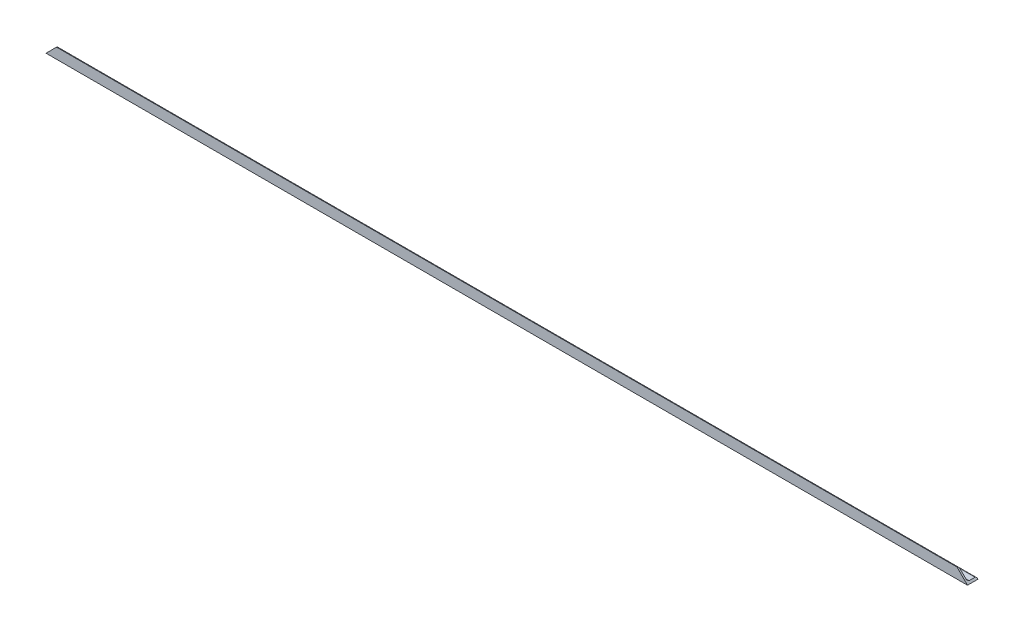
ISO-10303-21;
HEADER;
FILE_DESCRIPTION(('STEP AP214'),'2;1');
FILE_NAME('part.step','',(''),(''),'','','');
FILE_SCHEMA(('AUTOMOTIVE_DESIGN { 1 0 10303 214 1 1 1 1 }'));
ENDSEC;
DATA;
#1=APPLICATION_CONTEXT('core data for automotive mechanical design processes');
#2=APPLICATION_PROTOCOL_DEFINITION('international standard','automotive_design',2000,#1);
#3=PRODUCT_CONTEXT('',#1,'mechanical');
#4=PRODUCT('Part','Part','',(#3));
#5=PRODUCT_RELATED_PRODUCT_CATEGORY('part','',(#4));
#6=PRODUCT_DEFINITION_FORMATION('','',#4);
#7=PRODUCT_DEFINITION_CONTEXT('part definition',#1,'design');
#8=PRODUCT_DEFINITION('design','',#6,#7);
#9=PRODUCT_DEFINITION_SHAPE('','',#8);
#10=(LENGTH_UNIT() NAMED_UNIT(*) SI_UNIT(.MILLI.,.METRE.));
#11=(NAMED_UNIT(*) PLANE_ANGLE_UNIT() SI_UNIT($,.RADIAN.));
#12=(NAMED_UNIT(*) SI_UNIT($,.STERADIAN.) SOLID_ANGLE_UNIT());
#13=UNCERTAINTY_MEASURE_WITH_UNIT(LENGTH_MEASURE(1.E-05),#10,'distance_accuracy_value','');
#14=(GEOMETRIC_REPRESENTATION_CONTEXT(3) GLOBAL_UNCERTAINTY_ASSIGNED_CONTEXT((#13)) GLOBAL_UNIT_ASSIGNED_CONTEXT((#10,
#11,#12)) REPRESENTATION_CONTEXT('',''));
#15=CARTESIAN_POINT('',(0.,0.,0.));
#16=DIRECTION('',(0.,0.,1.));
#17=DIRECTION('',(1.,0.,0.));
#18=AXIS2_PLACEMENT_3D('',#15,#16,#17);
#19=CARTESIAN_POINT('',(1754.,0.,-20.));
#20=DIRECTION('',(0.,1.,0.));
#21=DIRECTION('',(0.,0.,1.));
#22=AXIS2_PLACEMENT_3D('',#19,#20,#21);
#23=PLANE('',#22);
#24=DIRECTION('',(0.,0.,-1.));
#25=VECTOR('',#24,1.);
#26=CARTESIAN_POINT('',(0.,0.,-20.));
#27=LINE('',#26,#25);
#28=CARTESIAN_POINT('',(0.,0.,0.));
#29=VERTEX_POINT('',#28);
#30=CARTESIAN_POINT('',(0.,0.,-20.));
#31=VERTEX_POINT('',#30);
#32=EDGE_CURVE('E119',#29,#31,#27,.T.);
#33=ORIENTED_EDGE('',*,*,#32,.T.);
#34=DIRECTION('',(-1.,0.,0.));
#35=VECTOR('',#34,1.);
#36=CARTESIAN_POINT('',(1754.,0.,-20.));
#37=LINE('',#36,#35);
#38=CARTESIAN_POINT('',(1754.,0.,-20.));
#39=VERTEX_POINT('',#38);
#40=EDGE_CURVE('E13',#39,#31,#37,.T.);
#41=ORIENTED_EDGE('',*,*,#40,.F.);
#42=DIRECTION('',(0.,0.,-1.));
#43=VECTOR('',#42,1.);
#44=CARTESIAN_POINT('',(1754.,0.,-20.));
#45=LINE('',#44,#43);
#46=CARTESIAN_POINT('',(1754.,0.,0.));
#47=VERTEX_POINT('',#46);
#48=EDGE_CURVE('E130',#47,#39,#45,.T.);
#49=ORIENTED_EDGE('',*,*,#48,.F.);
#50=DIRECTION('',(-1.,0.,0.));
#51=VECTOR('',#50,1.);
#52=CARTESIAN_POINT('',(1754.,0.,0.));
#53=LINE('',#52,#51);
#54=EDGE_CURVE('E136',#47,#29,#53,.T.);
#55=ORIENTED_EDGE('',*,*,#54,.T.);
#56=EDGE_LOOP('',(#33,#41,#49,#55));
#57=FACE_BOUND('',#56,.T.);
#58=ADVANCED_FACE('F65',(#57),#23,.F.);
#59=CARTESIAN_POINT('',(1754.,0.,-17.));
#60=DIRECTION('',(-1.,0.,0.));
#61=DIRECTION('',(0.,0.,1.));
#62=AXIS2_PLACEMENT_3D('',#59,#60,#61);
#63=CYLINDRICAL_SURFACE('',#62,3.);
#64=ORIENTED_EDGE('',*,*,#40,.T.);
#65=CARTESIAN_POINT('',(0.,0.,-17.));
#66=DIRECTION('',(0.707106781186548,-0.707106781186548,0.));
#67=DIRECTION('',(-0.707106781186548,-0.707106781186548,0.));
#68=AXIS2_PLACEMENT_3D('',#65,#66,#67);
#69=ELLIPSE('',#68,4.24264068711928,3.);
#70=CARTESIAN_POINT('',(3.00000000000011,3.,-17.));
#71=VERTEX_POINT('',#70);
#72=EDGE_CURVE('E125',#31,#71,#69,.T.);
#73=ORIENTED_EDGE('',*,*,#72,.T.);
#74=DIRECTION('',(-1.,0.,0.));
#75=VECTOR('',#74,1.);
#76=CARTESIAN_POINT('',(1754.,3.,-17.));
#77=LINE('',#76,#75);
#78=CARTESIAN_POINT('',(1751.,3.,-17.));
#79=VERTEX_POINT('',#78);
#80=EDGE_CURVE('E74',#79,#71,#77,.T.);
#81=ORIENTED_EDGE('',*,*,#80,.F.);
#82=CARTESIAN_POINT('',(1754.,0.,-17.));
#83=DIRECTION('',(-0.707106781186553,-0.707106781186542,0.));
#84=DIRECTION('',(-0.707106781186542,0.707106781186553,0.));
#85=AXIS2_PLACEMENT_3D('',#82,#83,#84);
#86=ELLIPSE('',#85,4.24264068711925,3.);
#87=EDGE_CURVE('E131',#79,#39,#86,.T.);
#88=ORIENTED_EDGE('',*,*,#87,.T.);
#89=EDGE_LOOP('',(#64,#73,#81,#88));
#90=FACE_BOUND('',#89,.T.);
#91=ADVANCED_FACE('F173',(#90),#63,.T.);
#92=CARTESIAN_POINT('',(1754.,3.,-6.5));
#93=DIRECTION('',(0.,-1.,0.));
#94=DIRECTION('',(0.,0.,-1.));
#95=AXIS2_PLACEMENT_3D('',#92,#93,#94);
#96=PLANE('',#95);
#97=ORIENTED_EDGE('',*,*,#80,.T.);
#98=DIRECTION('',(0.,0.,1.));
#99=VECTOR('',#98,1.);
#100=CARTESIAN_POINT('',(3.00000000000011,3.,-6.5));
#101=LINE('',#100,#99);
#102=CARTESIAN_POINT('',(3.00000000000011,3.,-6.5));
#103=VERTEX_POINT('',#102);
#104=EDGE_CURVE('E169',#71,#103,#101,.T.);
#105=ORIENTED_EDGE('',*,*,#104,.T.);
#106=DIRECTION('',(-1.,0.,0.));
#107=VECTOR('',#106,1.);
#108=CARTESIAN_POINT('',(1754.,3.,-6.5));
#109=LINE('',#108,#107);
#110=CARTESIAN_POINT('',(1751.,3.,-6.5));
#111=VERTEX_POINT('',#110);
#112=EDGE_CURVE('E158',#111,#103,#109,.T.);
#113=ORIENTED_EDGE('',*,*,#112,.F.);
#114=DIRECTION('',(0.,0.,-1.));
#115=VECTOR('',#114,1.);
#116=CARTESIAN_POINT('',(1751.,3.,-6.5));
#117=LINE('',#116,#115);
#118=EDGE_CURVE('E170',#111,#79,#117,.T.);
#119=ORIENTED_EDGE('',*,*,#118,.T.);
#120=EDGE_LOOP('',(#97,#105,#113,#119));
#121=FACE_BOUND('',#120,.T.);
#122=ADVANCED_FACE('F167',(#121),#96,.F.);
#123=CARTESIAN_POINT('',(1754.,6.5,-6.5));
#124=DIRECTION('',(-1.,0.,0.));
#125=DIRECTION('',(0.,0.,1.));
#126=AXIS2_PLACEMENT_3D('',#123,#124,#125);
#127=CYLINDRICAL_SURFACE('',#126,3.5);
#128=ORIENTED_EDGE('',*,*,#112,.T.);
#129=CARTESIAN_POINT('',(6.49999999999995,6.5,-6.5));
#130=DIRECTION('',(0.707106781186548,-0.707106781186548,0.));
#131=DIRECTION('',(-0.707106781186548,-0.707106781186548,0.));
#132=AXIS2_PLACEMENT_3D('',#129,#130,#131);
#133=ELLIPSE('',#132,4.94974746830583,3.5);
#134=CARTESIAN_POINT('',(6.50000000000017,6.50000000000006,-3.));
#135=VERTEX_POINT('',#134);
#136=EDGE_CURVE('E182',#103,#135,#133,.F.);
#137=ORIENTED_EDGE('',*,*,#136,.T.);
#138=DIRECTION('',(-1.,0.,0.));
#139=VECTOR('',#138,1.);
#140=CARTESIAN_POINT('',(1754.,6.5,-3.));
#141=LINE('',#140,#139);
#142=CARTESIAN_POINT('',(1747.5,6.5,-3.));
#143=VERTEX_POINT('',#142);
#144=EDGE_CURVE('E154',#143,#135,#141,.T.);
#145=ORIENTED_EDGE('',*,*,#144,.F.);
#146=CARTESIAN_POINT('',(1747.5,6.5,-6.5));
#147=DIRECTION('',(-0.707106781186553,-0.707106781186542,0.));
#148=DIRECTION('',(-0.707106781186542,0.707106781186553,0.));
#149=AXIS2_PLACEMENT_3D('',#146,#147,#148);
#150=ELLIPSE('',#149,4.9497474683058,3.5);
#151=EDGE_CURVE('E189',#143,#111,#150,.F.);
#152=ORIENTED_EDGE('',*,*,#151,.T.);
#153=EDGE_LOOP('',(#128,#137,#145,#152));
#154=FACE_BOUND('',#153,.T.);
#155=ADVANCED_FACE('F198',(#154),#127,.F.);
#156=CARTESIAN_POINT('',(1754.,17.,-3.));
#157=DIRECTION('',(0.,0.,1.));
#158=DIRECTION('',(0.,-1.,0.));
#159=AXIS2_PLACEMENT_3D('',#156,#157,#158);
#160=PLANE('',#159);
#161=ORIENTED_EDGE('',*,*,#144,.T.);
#162=DIRECTION('',(0.707106781186548,0.707106781186548,0.));
#163=VECTOR('',#162,1.);
#164=CARTESIAN_POINT('',(885.5,885.5,-3.00000000000004));
#165=LINE('',#164,#163);
#166=CARTESIAN_POINT('',(16.9999999999999,17.,-3.));
#167=VERTEX_POINT('',#166);
#168=EDGE_CURVE('E205',#135,#167,#165,.T.);
#169=ORIENTED_EDGE('',*,*,#168,.T.);
#170=DIRECTION('',(-1.,0.,0.));
#171=VECTOR('',#170,1.);
#172=CARTESIAN_POINT('',(1754.,17.,-3.));
#173=LINE('',#172,#171);
#174=CARTESIAN_POINT('',(1737.,17.,-3.));
#175=VERTEX_POINT('',#174);
#176=EDGE_CURVE('E147',#175,#167,#173,.T.);
#177=ORIENTED_EDGE('',*,*,#176,.F.);
#178=DIRECTION('',(0.707106781186542,-0.707106781186553,0.));
#179=VECTOR('',#178,1.);
#180=CARTESIAN_POINT('',(1745.5,8.50000000000013,-3.));
#181=LINE('',#180,#179);
#182=EDGE_CURVE('E180',#175,#143,#181,.T.);
#183=ORIENTED_EDGE('',*,*,#182,.T.);
#184=EDGE_LOOP('',(#161,#169,#177,#183));
#185=FACE_BOUND('',#184,.T.);
#186=ADVANCED_FACE('F203',(#185),#160,.F.);
#187=CARTESIAN_POINT('',(1754.,17.,0.));
#188=DIRECTION('',(-1.,0.,0.));
#189=DIRECTION('',(0.,0.,1.));
#190=AXIS2_PLACEMENT_3D('',#187,#188,#189);
#191=CYLINDRICAL_SURFACE('',#190,3.);
#192=ORIENTED_EDGE('',*,*,#176,.T.);
#193=CARTESIAN_POINT('',(16.9999999999999,17.,0.));
#194=DIRECTION('',(0.707106781186548,-0.707106781186548,0.));
#195=DIRECTION('',(-0.707106781186548,-0.707106781186548,0.));
#196=AXIS2_PLACEMENT_3D('',#193,#194,#195);
#197=ELLIPSE('',#196,4.24264068711928,3.);
#198=CARTESIAN_POINT('',(20.,20.,0.));
#199=VERTEX_POINT('',#198);
#200=EDGE_CURVE('E141',#167,#199,#197,.T.);
#201=ORIENTED_EDGE('',*,*,#200,.T.);
#202=DIRECTION('',(-1.,0.,0.));
#203=VECTOR('',#202,1.);
#204=CARTESIAN_POINT('',(1754.,20.,0.));
#205=LINE('',#204,#203);
#206=CARTESIAN_POINT('',(1734.,20.0000000000003,0.));
#207=VERTEX_POINT('',#206);
#208=EDGE_CURVE('E139',#207,#199,#205,.T.);
#209=ORIENTED_EDGE('',*,*,#208,.F.);
#210=CARTESIAN_POINT('',(1737.,17.,0.));
#211=DIRECTION('',(-0.707106781186553,-0.707106781186542,0.));
#212=DIRECTION('',(-0.707106781186542,0.707106781186553,0.));
#213=AXIS2_PLACEMENT_3D('',#210,#211,#212);
#214=ELLIPSE('',#213,4.24264068711925,3.);
#215=EDGE_CURVE('E175',#207,#175,#214,.T.);
#216=ORIENTED_EDGE('',*,*,#215,.T.);
#217=EDGE_LOOP('',(#192,#201,#209,#216));
#218=FACE_BOUND('',#217,.T.);
#219=ADVANCED_FACE('F207',(#218),#191,.T.);
#220=CARTESIAN_POINT('',(1754.,20.,0.));
#221=DIRECTION('',(0.,0.,-1.));
#222=DIRECTION('',(-1.,0.,0.));
#223=AXIS2_PLACEMENT_3D('',#220,#221,#222);
#224=PLANE('',#223);
#225=ORIENTED_EDGE('',*,*,#208,.T.);
#226=DIRECTION('',(0.707106781186548,0.707106781186548,0.));
#227=VECTOR('',#226,1.);
#228=CARTESIAN_POINT('',(20.,20.,0.));
#229=LINE('',#228,#227);
#230=EDGE_CURVE('E122',#29,#199,#229,.T.);
#231=ORIENTED_EDGE('',*,*,#230,.F.);
#232=ORIENTED_EDGE('',*,*,#54,.F.);
#233=DIRECTION('',(0.707106781186542,-0.707106781186553,0.));
#234=VECTOR('',#233,1.);
#235=CARTESIAN_POINT('',(1734.,20.0000000000003,0.));
#236=LINE('',#235,#234);
#237=EDGE_CURVE('E80',#207,#47,#236,.T.);
#238=ORIENTED_EDGE('',*,*,#237,.F.);
#239=EDGE_LOOP('',(#225,#231,#232,#238));
#240=FACE_BOUND('',#239,.T.);
#241=ADVANCED_FACE('F135',(#240),#224,.F.);
#242=CARTESIAN_POINT('',(20.,20.,-20.));
#243=DIRECTION('',(0.707106781186548,-0.707106781186548,0.));
#244=DIRECTION('',(0.707106781186548,0.707106781186548,0.));
#245=AXIS2_PLACEMENT_3D('',#242,#243,#244);
#246=PLANE('',#245);
#247=ORIENTED_EDGE('',*,*,#32,.F.);
#248=ORIENTED_EDGE('',*,*,#230,.T.);
#249=ORIENTED_EDGE('',*,*,#200,.F.);
#250=ORIENTED_EDGE('',*,*,#168,.F.);
#251=ORIENTED_EDGE('',*,*,#136,.F.);
#252=ORIENTED_EDGE('',*,*,#104,.F.);
#253=ORIENTED_EDGE('',*,*,#72,.F.);
#254=EDGE_LOOP('',(#247,#248,#249,#250,#251,#252,#253));
#255=FACE_BOUND('',#254,.T.);
#256=ADVANCED_FACE('F121',(#255),#246,.F.);
#257=CARTESIAN_POINT('',(1734.,20.0000000000003,-20.));
#258=DIRECTION('',(-0.707106781186553,-0.707106781186542,0.));
#259=DIRECTION('',(0.707106781186542,-0.707106781186553,0.));
#260=AXIS2_PLACEMENT_3D('',#257,#258,#259);
#261=PLANE('',#260);
#262=ORIENTED_EDGE('',*,*,#118,.F.);
#263=ORIENTED_EDGE('',*,*,#151,.F.);
#264=ORIENTED_EDGE('',*,*,#182,.F.);
#265=ORIENTED_EDGE('',*,*,#215,.F.);
#266=ORIENTED_EDGE('',*,*,#237,.T.);
#267=ORIENTED_EDGE('',*,*,#48,.T.);
#268=ORIENTED_EDGE('',*,*,#87,.F.);
#269=EDGE_LOOP('',(#262,#263,#264,#265,#266,#267,#268));
#270=FACE_BOUND('',#269,.T.);
#271=ADVANCED_FACE('F200',(#270),#261,.F.);
#272=CLOSED_SHELL('',(#58,#91,#122,#155,#186,#219,#241,#256,#271));
#273=MANIFOLD_SOLID_BREP('B2',#272);
#274=ADVANCED_BREP_SHAPE_REPRESENTATION('',(#18,#273),#14);
#275=SHAPE_DEFINITION_REPRESENTATION(#9,#274);
ENDSEC;
END-ISO-10303-21;
